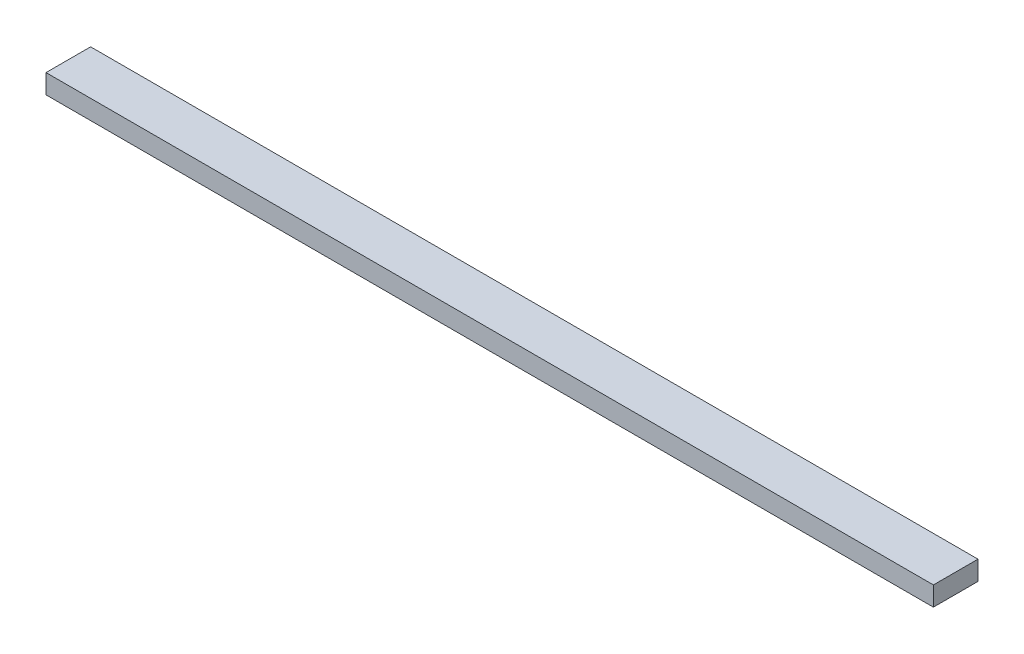
ISO-10303-21;
HEADER;
FILE_DESCRIPTION(('STEP AP214'),'2;1');
FILE_NAME('part.step','',(''),(''),'','','');
FILE_SCHEMA(('AUTOMOTIVE_DESIGN { 1 0 10303 214 1 1 1 1 }'));
ENDSEC;
DATA;
#1=APPLICATION_CONTEXT('core data for automotive mechanical design processes');
#2=APPLICATION_PROTOCOL_DEFINITION('international standard','automotive_design',2000,#1);
#3=PRODUCT_CONTEXT('',#1,'mechanical');
#4=PRODUCT('Part','Part','',(#3));
#5=PRODUCT_RELATED_PRODUCT_CATEGORY('part','',(#4));
#6=PRODUCT_DEFINITION_FORMATION('','',#4);
#7=PRODUCT_DEFINITION_CONTEXT('part definition',#1,'design');
#8=PRODUCT_DEFINITION('design','',#6,#7);
#9=PRODUCT_DEFINITION_SHAPE('','',#8);
#10=(LENGTH_UNIT() NAMED_UNIT(*) SI_UNIT(.MILLI.,.METRE.));
#11=(NAMED_UNIT(*) PLANE_ANGLE_UNIT() SI_UNIT($,.RADIAN.));
#12=(NAMED_UNIT(*) SI_UNIT($,.STERADIAN.) SOLID_ANGLE_UNIT());
#13=UNCERTAINTY_MEASURE_WITH_UNIT(LENGTH_MEASURE(1.E-05),#10,'distance_accuracy_value','');
#14=(GEOMETRIC_REPRESENTATION_CONTEXT(3) GLOBAL_UNCERTAINTY_ASSIGNED_CONTEXT((#13)) GLOBAL_UNIT_ASSIGNED_CONTEXT((#10,
#11,#12)) REPRESENTATION_CONTEXT('',''));
#15=CARTESIAN_POINT('',(0.,0.,0.));
#16=DIRECTION('',(0.,0.,1.));
#17=DIRECTION('',(1.,0.,0.));
#18=AXIS2_PLACEMENT_3D('',#15,#16,#17);
#19=CARTESIAN_POINT('',(1752.6,-19.05,44.053125));
#20=DIRECTION('',(0.,0.,-1.));
#21=DIRECTION('',(-1.,0.,0.));
#22=AXIS2_PLACEMENT_3D('',#19,#20,#21);
#23=PLANE('',#22);
#24=DIRECTION('',(0.,-1.,0.));
#25=VECTOR('',#24,1.);
#26=CARTESIAN_POINT('',(0.,-19.05,44.053125));
#27=LINE('',#26,#25);
#28=CARTESIAN_POINT('',(0.,19.05,44.053125));
#29=VERTEX_POINT('',#28);
#30=CARTESIAN_POINT('',(0.,-19.05,44.053125));
#31=VERTEX_POINT('',#30);
#32=EDGE_CURVE('E96',#29,#31,#27,.T.);
#33=ORIENTED_EDGE('',*,*,#32,.T.);
#34=DIRECTION('',(-1.,0.,0.));
#35=VECTOR('',#34,1.);
#36=CARTESIAN_POINT('',(1752.6,-19.05,44.053125));
#37=LINE('',#36,#35);
#38=CARTESIAN_POINT('',(1752.6,-19.05,44.053125));
#39=VERTEX_POINT('',#38);
#40=EDGE_CURVE('E11',#39,#31,#37,.T.);
#41=ORIENTED_EDGE('',*,*,#40,.F.);
#42=DIRECTION('',(0.,-1.,0.));
#43=VECTOR('',#42,1.);
#44=CARTESIAN_POINT('',(1752.6,-19.05,44.053125));
#45=LINE('',#44,#43);
#46=CARTESIAN_POINT('',(1752.6,19.05,44.053125));
#47=VERTEX_POINT('',#46);
#48=EDGE_CURVE('E84',#47,#39,#45,.T.);
#49=ORIENTED_EDGE('',*,*,#48,.F.);
#50=DIRECTION('',(-1.,0.,0.));
#51=VECTOR('',#50,1.);
#52=CARTESIAN_POINT('',(1752.6,19.05,44.053125));
#53=LINE('',#52,#51);
#54=EDGE_CURVE('E92',#47,#29,#53,.T.);
#55=ORIENTED_EDGE('',*,*,#54,.T.);
#56=EDGE_LOOP('',(#33,#41,#49,#55));
#57=FACE_BOUND('',#56,.T.);
#58=ADVANCED_FACE('F33',(#57),#23,.F.);
#59=CARTESIAN_POINT('',(1752.6,-19.05,-44.053125));
#60=DIRECTION('',(0.,1.,0.));
#61=DIRECTION('',(0.,0.,1.));
#62=AXIS2_PLACEMENT_3D('',#59,#60,#61);
#63=PLANE('',#62);
#64=DIRECTION('',(0.,0.,-1.));
#65=VECTOR('',#64,1.);
#66=CARTESIAN_POINT('',(0.,-19.05,-44.053125));
#67=LINE('',#66,#65);
#68=CARTESIAN_POINT('',(0.,-19.05,-44.053125));
#69=VERTEX_POINT('',#68);
#70=EDGE_CURVE('E88',#31,#69,#67,.T.);
#71=ORIENTED_EDGE('',*,*,#70,.T.);
#72=DIRECTION('',(-1.,0.,0.));
#73=VECTOR('',#72,1.);
#74=CARTESIAN_POINT('',(1752.6,-19.05,-44.053125));
#75=LINE('',#74,#73);
#76=CARTESIAN_POINT('',(1752.6,-19.05,-44.053125));
#77=VERTEX_POINT('',#76);
#78=EDGE_CURVE('E41',#77,#69,#75,.T.);
#79=ORIENTED_EDGE('',*,*,#78,.F.);
#80=DIRECTION('',(0.,0.,-1.));
#81=VECTOR('',#80,1.);
#82=CARTESIAN_POINT('',(1752.6,-19.05,-44.053125));
#83=LINE('',#82,#81);
#84=EDGE_CURVE('E79',#39,#77,#83,.T.);
#85=ORIENTED_EDGE('',*,*,#84,.F.);
#86=ORIENTED_EDGE('',*,*,#40,.T.);
#87=EDGE_LOOP('',(#71,#79,#85,#86));
#88=FACE_BOUND('',#87,.T.);
#89=ADVANCED_FACE('F87',(#88),#63,.F.);
#90=CARTESIAN_POINT('',(1752.6,-19.05,-44.053125));
#91=DIRECTION('',(0.,0.,1.));
#92=DIRECTION('',(1.,0.,0.));
#93=AXIS2_PLACEMENT_3D('',#90,#91,#92);
#94=PLANE('',#93);
#95=DIRECTION('',(0.,1.,0.));
#96=VECTOR('',#95,1.);
#97=CARTESIAN_POINT('',(0.,-19.05,-44.053125));
#98=LINE('',#97,#96);
#99=CARTESIAN_POINT('',(0.,19.05,-44.053125));
#100=VERTEX_POINT('',#99);
#101=EDGE_CURVE('E66',#69,#100,#98,.T.);
#102=ORIENTED_EDGE('',*,*,#101,.T.);
#103=DIRECTION('',(-1.,0.,0.));
#104=VECTOR('',#103,1.);
#105=CARTESIAN_POINT('',(1752.6,19.05,-44.053125));
#106=LINE('',#105,#104);
#107=CARTESIAN_POINT('',(1752.6,19.05,-44.053125));
#108=VERTEX_POINT('',#107);
#109=EDGE_CURVE('E89',#108,#100,#106,.T.);
#110=ORIENTED_EDGE('',*,*,#109,.F.);
#111=DIRECTION('',(0.,1.,0.));
#112=VECTOR('',#111,1.);
#113=CARTESIAN_POINT('',(1752.6,-19.05,-44.053125));
#114=LINE('',#113,#112);
#115=EDGE_CURVE('E82',#77,#108,#114,.T.);
#116=ORIENTED_EDGE('',*,*,#115,.F.);
#117=ORIENTED_EDGE('',*,*,#78,.T.);
#118=EDGE_LOOP('',(#102,#110,#116,#117));
#119=FACE_BOUND('',#118,.T.);
#120=ADVANCED_FACE('F90',(#119),#94,.F.);
#121=CARTESIAN_POINT('',(1752.6,19.05,-44.053125));
#122=DIRECTION('',(0.,-1.,0.));
#123=DIRECTION('',(0.,0.,-1.));
#124=AXIS2_PLACEMENT_3D('',#121,#122,#123);
#125=PLANE('',#124);
#126=DIRECTION('',(0.,0.,1.));
#127=VECTOR('',#126,1.);
#128=CARTESIAN_POINT('',(0.,19.05,-44.053125));
#129=LINE('',#128,#127);
#130=EDGE_CURVE('E72',#100,#29,#129,.T.);
#131=ORIENTED_EDGE('',*,*,#130,.T.);
#132=ORIENTED_EDGE('',*,*,#54,.F.);
#133=DIRECTION('',(0.,0.,1.));
#134=VECTOR('',#133,1.);
#135=CARTESIAN_POINT('',(1752.6,19.05,-44.053125));
#136=LINE('',#135,#134);
#137=EDGE_CURVE('E49',#108,#47,#136,.T.);
#138=ORIENTED_EDGE('',*,*,#137,.F.);
#139=ORIENTED_EDGE('',*,*,#109,.T.);
#140=EDGE_LOOP('',(#131,#132,#138,#139));
#141=FACE_BOUND('',#140,.T.);
#142=ADVANCED_FACE('F103',(#141),#125,.F.);
#143=CARTESIAN_POINT('',(1752.6,0.,0.));
#144=DIRECTION('',(1.,0.,0.));
#145=DIRECTION('',(0.,0.,-1.));
#146=AXIS2_PLACEMENT_3D('',#143,#144,#145);
#147=PLANE('',#146);
#148=ORIENTED_EDGE('',*,*,#48,.T.);
#149=ORIENTED_EDGE('',*,*,#84,.T.);
#150=ORIENTED_EDGE('',*,*,#115,.T.);
#151=ORIENTED_EDGE('',*,*,#137,.T.);
#152=EDGE_LOOP('',(#148,#149,#150,#151));
#153=FACE_BOUND('',#152,.T.);
#154=ADVANCED_FACE('F80',(#153),#147,.T.);
#155=CARTESIAN_POINT('',(0.,0.,0.));
#156=DIRECTION('',(1.,0.,0.));
#157=DIRECTION('',(0.,0.,-1.));
#158=AXIS2_PLACEMENT_3D('',#155,#156,#157);
#159=PLANE('',#158);
#160=ORIENTED_EDGE('',*,*,#32,.F.);
#161=ORIENTED_EDGE('',*,*,#130,.F.);
#162=ORIENTED_EDGE('',*,*,#101,.F.);
#163=ORIENTED_EDGE('',*,*,#70,.F.);
#164=EDGE_LOOP('',(#160,#161,#162,#163));
#165=FACE_BOUND('',#164,.T.);
#166=ADVANCED_FACE('F106',(#165),#159,.F.);
#167=CLOSED_SHELL('',(#58,#89,#120,#142,#154,#166));
#168=MANIFOLD_SOLID_BREP('B2',#167);
#169=ADVANCED_BREP_SHAPE_REPRESENTATION('',(#18,#168),#14);
#170=SHAPE_DEFINITION_REPRESENTATION(#9,#169);
ENDSEC;
END-ISO-10303-21;
